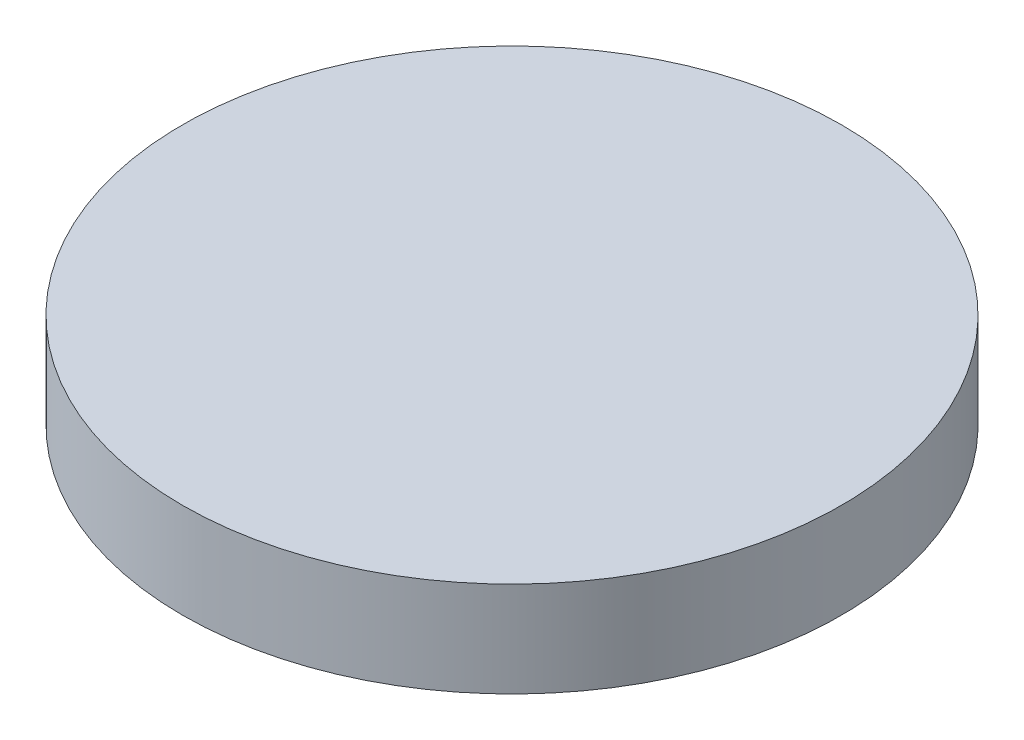
ISO-10303-21;
HEADER;
FILE_DESCRIPTION(('STEP AP214'),'2;1');
FILE_NAME('part.step','',(''),(''),'','','');
FILE_SCHEMA(('AUTOMOTIVE_DESIGN { 1 0 10303 214 1 1 1 1 }'));
ENDSEC;
DATA;
#1=APPLICATION_CONTEXT('core data for automotive mechanical design processes');
#2=APPLICATION_PROTOCOL_DEFINITION('international standard','automotive_design',2000,#1);
#3=PRODUCT_CONTEXT('',#1,'mechanical');
#4=PRODUCT('Part','Part','',(#3));
#5=PRODUCT_RELATED_PRODUCT_CATEGORY('part','',(#4));
#6=PRODUCT_DEFINITION_FORMATION('','',#4);
#7=PRODUCT_DEFINITION_CONTEXT('part definition',#1,'design');
#8=PRODUCT_DEFINITION('design','',#6,#7);
#9=PRODUCT_DEFINITION_SHAPE('','',#8);
#10=(LENGTH_UNIT() NAMED_UNIT(*) SI_UNIT(.MILLI.,.METRE.));
#11=(NAMED_UNIT(*) PLANE_ANGLE_UNIT() SI_UNIT($,.RADIAN.));
#12=(NAMED_UNIT(*) SI_UNIT($,.STERADIAN.) SOLID_ANGLE_UNIT());
#13=UNCERTAINTY_MEASURE_WITH_UNIT(LENGTH_MEASURE(1.E-05),#10,'distance_accuracy_value','');
#14=(GEOMETRIC_REPRESENTATION_CONTEXT(3) GLOBAL_UNCERTAINTY_ASSIGNED_CONTEXT((#13)) GLOBAL_UNIT_ASSIGNED_CONTEXT((#10,
#11,#12)) REPRESENTATION_CONTEXT('',''));
#15=CARTESIAN_POINT('',(0.,0.,0.));
#16=DIRECTION('',(0.,0.,1.));
#17=DIRECTION('',(1.,0.,0.));
#18=AXIS2_PLACEMENT_3D('',#15,#16,#17);
#19=CARTESIAN_POINT('',(0.,10.,0.));
#20=DIRECTION('',(0.,-1.,0.));
#21=DIRECTION('',(0.,0.,-1.));
#22=AXIS2_PLACEMENT_3D('',#19,#20,#21);
#23=CYLINDRICAL_SURFACE('',#22,34.6328661745544);
#24=CARTESIAN_POINT('',(0.,10.,0.));
#25=DIRECTION('',(0.,1.,0.));
#26=DIRECTION('',(0.,0.,1.));
#27=AXIS2_PLACEMENT_3D('',#24,#25,#26);
#28=CIRCLE('',#27,34.6328661745544);
#29=CARTESIAN_POINT('',(0.,10.,34.6328661745544));
#30=VERTEX_POINT('',#29);
#31=EDGE_CURVE('E10',#30,#30,#28,.T.);
#32=ORIENTED_EDGE('',*,*,#31,.F.);
#33=EDGE_LOOP('',(#32));
#34=FACE_BOUND('',#33,.T.);
#35=CARTESIAN_POINT('',(0.,0.,0.));
#36=DIRECTION('',(0.,1.,0.));
#37=DIRECTION('',(0.,0.,1.));
#38=AXIS2_PLACEMENT_3D('',#35,#36,#37);
#39=CIRCLE('',#38,34.6328661745544);
#40=CARTESIAN_POINT('',(0.,0.,34.6328661745544));
#41=VERTEX_POINT('',#40);
#42=EDGE_CURVE('E34',#41,#41,#39,.T.);
#43=ORIENTED_EDGE('',*,*,#42,.T.);
#44=EDGE_LOOP('',(#43));
#45=FACE_BOUND('',#44,.T.);
#46=ADVANCED_FACE('F31',(#34,#45),#23,.T.);
#47=CARTESIAN_POINT('',(0.,10.,0.));
#48=DIRECTION('',(0.,1.,0.));
#49=DIRECTION('',(0.,0.,1.));
#50=AXIS2_PLACEMENT_3D('',#47,#48,#49);
#51=PLANE('',#50);
#52=ORIENTED_EDGE('',*,*,#31,.T.);
#53=EDGE_LOOP('',(#52));
#54=FACE_BOUND('',#53,.T.);
#55=ADVANCED_FACE('F46',(#54),#51,.T.);
#56=CARTESIAN_POINT('',(0.,0.,0.));
#57=DIRECTION('',(0.,1.,0.));
#58=DIRECTION('',(0.,0.,1.));
#59=AXIS2_PLACEMENT_3D('',#56,#57,#58);
#60=PLANE('',#59);
#61=ORIENTED_EDGE('',*,*,#42,.F.);
#62=EDGE_LOOP('',(#61));
#63=FACE_BOUND('',#62,.T.);
#64=ADVANCED_FACE('F44',(#63),#60,.F.);
#65=CLOSED_SHELL('',(#46,#55,#64));
#66=MANIFOLD_SOLID_BREP('B2',#65);
#67=ADVANCED_BREP_SHAPE_REPRESENTATION('',(#18,#66),#14);
#68=SHAPE_DEFINITION_REPRESENTATION(#9,#67);
ENDSEC;
END-ISO-10303-21;
